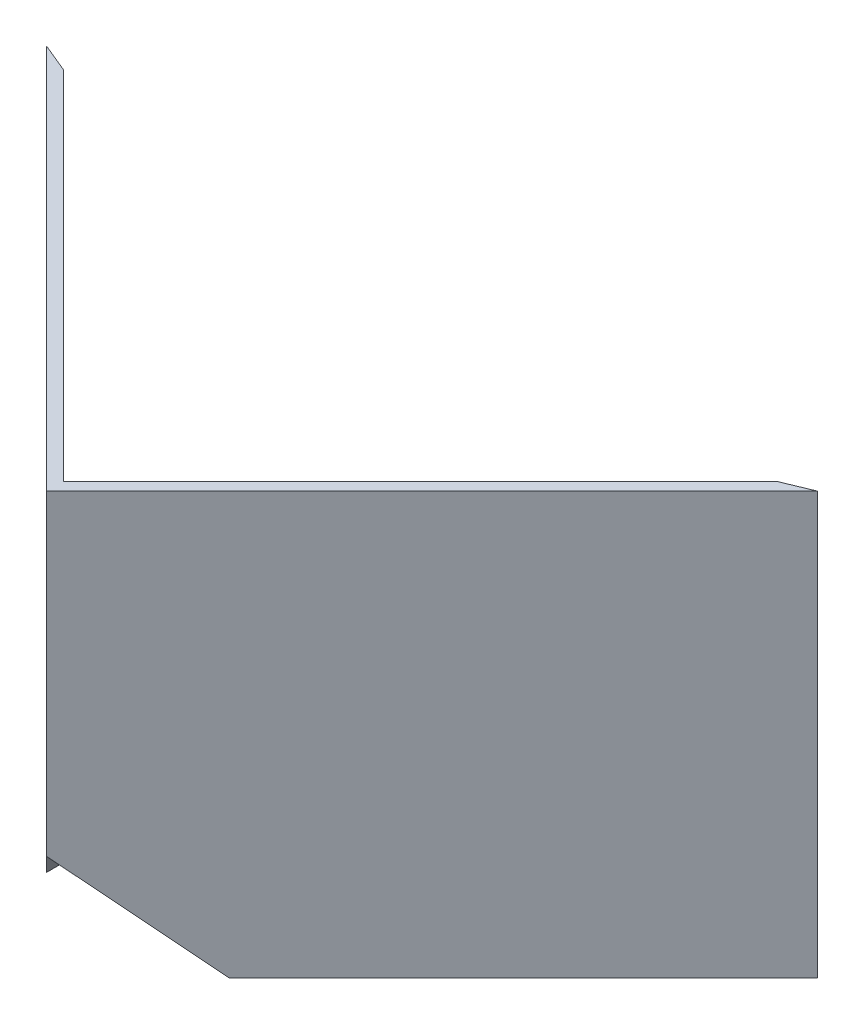
ISO-10303-21;
HEADER;
FILE_DESCRIPTION(('STEP AP214'),'2;1');
FILE_NAME('part.step','',(''),(''),'','','');
FILE_SCHEMA(('AUTOMOTIVE_DESIGN { 1 0 10303 214 1 1 1 1 }'));
ENDSEC;
DATA;
#1=APPLICATION_CONTEXT('core data for automotive mechanical design processes');
#2=APPLICATION_PROTOCOL_DEFINITION('international standard','automotive_design',2000,#1);
#3=PRODUCT_CONTEXT('',#1,'mechanical');
#4=PRODUCT('Part','Part','',(#3));
#5=PRODUCT_RELATED_PRODUCT_CATEGORY('part','',(#4));
#6=PRODUCT_DEFINITION_FORMATION('','',#4);
#7=PRODUCT_DEFINITION_CONTEXT('part definition',#1,'design');
#8=PRODUCT_DEFINITION('design','',#6,#7);
#9=PRODUCT_DEFINITION_SHAPE('','',#8);
#10=(LENGTH_UNIT() NAMED_UNIT(*) SI_UNIT(.MILLI.,.METRE.));
#11=(NAMED_UNIT(*) PLANE_ANGLE_UNIT() SI_UNIT($,.RADIAN.));
#12=(NAMED_UNIT(*) SI_UNIT($,.STERADIAN.) SOLID_ANGLE_UNIT());
#13=UNCERTAINTY_MEASURE_WITH_UNIT(LENGTH_MEASURE(1.E-05),#10,'distance_accuracy_value','');
#14=(GEOMETRIC_REPRESENTATION_CONTEXT(3) GLOBAL_UNCERTAINTY_ASSIGNED_CONTEXT((#13)) GLOBAL_UNIT_ASSIGNED_CONTEXT((#10,
#11,#12)) REPRESENTATION_CONTEXT('',''));
#15=CARTESIAN_POINT('',(0.,0.,0.));
#16=DIRECTION('',(0.,0.,1.));
#17=DIRECTION('',(1.,0.,0.));
#18=AXIS2_PLACEMENT_3D('',#15,#16,#17);
#19=CARTESIAN_POINT('',(0.,-35.,0.));
#20=DIRECTION('',(0.,-1.,0.));
#21=DIRECTION('',(0.,0.,-1.));
#22=AXIS2_PLACEMENT_3D('',#19,#20,#21);
#23=PLANE('',#22);
#24=DIRECTION('',(0.,0.,-1.));
#25=VECTOR('',#24,1.);
#26=CARTESIAN_POINT('',(-15.1800011305056,-35.,0.));
#27=LINE('',#26,#25);
#28=CARTESIAN_POINT('',(-15.1800011305056,-35.,48.8199997568609));
#29=VERTEX_POINT('',#28);
#30=CARTESIAN_POINT('',(-15.1800011305056,-35.,45.9915726064096));
#31=VERTEX_POINT('',#30);
#32=EDGE_CURVE('E11',#29,#31,#27,.T.);
#33=ORIENTED_EDGE('',*,*,#32,.F.);
#34=DIRECTION('',(0.707106774760258,0.,0.707106787612837));
#35=VECTOR('',#34,1.);
#36=CARTESIAN_POINT('',(-1.13050556416194E-06,-35.,64.0000000327771));
#37=LINE('',#36,#35);
#38=CARTESIAN_POINT('',(-64.,-35.,0.));
#39=VERTEX_POINT('',#38);
#40=EDGE_CURVE('E135',#39,#29,#37,.T.);
#41=ORIENTED_EDGE('',*,*,#40,.F.);
#42=DIRECTION('',(-0.923879530772346,0.,-0.382683436563264));
#43=VECTOR('',#42,1.);
#44=CARTESIAN_POINT('',(-59.1715729373115,-35.,2.));
#45=LINE('',#44,#43);
#46=CARTESIAN_POINT('',(-59.1715729373115,-35.,2.));
#47=VERTEX_POINT('',#46);
#48=EDGE_CURVE('E133',#47,#39,#45,.T.);
#49=ORIENTED_EDGE('',*,*,#48,.F.);
#50=DIRECTION('',(-0.707106774760258,0.,-0.707106787612837));
#51=VECTOR('',#50,1.);
#52=CARTESIAN_POINT('',(-1.10480040903317E-06,-35.,61.1715729080309));
#53=LINE('',#52,#51);
#54=EDGE_CURVE('E130',#31,#47,#53,.T.);
#55=ORIENTED_EDGE('',*,*,#54,.F.);
#56=EDGE_LOOP('',(#33,#41,#49,#55));
#57=FACE_BOUND('',#56,.T.);
#58=ADVANCED_FACE('F33',(#57),#23,.T.);
#59=CARTESIAN_POINT('',(59.1715728787502,35.,2.));
#60=DIRECTION('',(0.707106774760258,0.,0.707106787612837));
#61=DIRECTION('',(0.707106787612837,0.,-0.707106774760258));
#62=AXIS2_PLACEMENT_3D('',#59,#60,#61);
#63=PLANE('',#62);
#64=DIRECTION('',(-0.707106787612837,0.,0.707106774760258));
#65=VECTOR('',#64,1.);
#66=CARTESIAN_POINT('',(59.1715728787502,-35.,2.));
#67=LINE('',#66,#65);
#68=CARTESIAN_POINT('',(59.1715728787502,-35.,2.));
#69=VERTEX_POINT('',#68);
#70=CARTESIAN_POINT('',(15.1799988694944,-35.,45.9915732096521));
#71=VERTEX_POINT('',#70);
#72=EDGE_CURVE('E127',#69,#71,#67,.T.);
#73=ORIENTED_EDGE('',*,*,#72,.T.);
#74=DIRECTION('',(-0.548077019880069,0.631841096699684,0.548077009918061));
#75=VECTOR('',#74,1.);
#76=CARTESIAN_POINT('',(17.3682862122527,-37.5227291500837,43.8032859066688));
#77=LINE('',#76,#75);
#78=CARTESIAN_POINT('',(-1.13050556936611E-06,-17.5,61.1715728823257));
#79=VERTEX_POINT('',#78);
#80=EDGE_CURVE('E48',#71,#79,#77,.T.);
#81=ORIENTED_EDGE('',*,*,#80,.T.);
#82=DIRECTION('',(0.,-1.,0.));
#83=VECTOR('',#82,1.);
#84=CARTESIAN_POINT('',(-1.10480040903317E-06,35.,61.1715729080309));
#85=LINE('',#84,#83);
#86=CARTESIAN_POINT('',(-1.10480040903317E-06,35.,61.1715729080309));
#87=VERTEX_POINT('',#86);
#88=EDGE_CURVE('E147',#87,#79,#85,.T.);
#89=ORIENTED_EDGE('',*,*,#88,.F.);
#90=DIRECTION('',(-0.707106787612837,0.,0.707106774760258));
#91=VECTOR('',#90,1.);
#92=CARTESIAN_POINT('',(59.1715728787502,35.,2.));
#93=LINE('',#92,#91);
#94=CARTESIAN_POINT('',(59.1715728787502,35.,2.));
#95=VERTEX_POINT('',#94);
#96=EDGE_CURVE('E140',#95,#87,#93,.T.);
#97=ORIENTED_EDGE('',*,*,#96,.F.);
#98=DIRECTION('',(0.,-1.,0.));
#99=VECTOR('',#98,1.);
#100=CARTESIAN_POINT('',(59.1715728787502,35.,2.));
#101=LINE('',#100,#99);
#102=EDGE_CURVE('E123',#95,#69,#101,.T.);
#103=ORIENTED_EDGE('',*,*,#102,.T.);
#104=EDGE_LOOP('',(#73,#81,#89,#97,#103));
#105=FACE_BOUND('',#104,.T.);
#106=ADVANCED_FACE('F35',(#105),#63,.F.);
#107=CARTESIAN_POINT('',(-1.10480040903317E-06,35.,61.1715729080309));
#108=DIRECTION('',(-0.707106787612837,0.,0.707106774760258));
#109=DIRECTION('',(0.707106774760258,0.,0.707106787612837));
#110=AXIS2_PLACEMENT_3D('',#107,#108,#109);
#111=PLANE('',#110);
#112=ORIENTED_EDGE('',*,*,#88,.T.);
#113=DIRECTION('',(-0.548077013895126,-0.631841089800046,-0.548077023857133));
#114=VECTOR('',#113,1.);
#115=CARTESIAN_POINT('',(18.1806217170147,3.45921606268804,79.3521960603023));
#116=LINE('',#115,#114);
#117=EDGE_CURVE('E131',#79,#31,#116,.T.);
#118=ORIENTED_EDGE('',*,*,#117,.T.);
#119=ORIENTED_EDGE('',*,*,#54,.T.);
#120=DIRECTION('',(0.,-1.,0.));
#121=VECTOR('',#120,1.);
#122=CARTESIAN_POINT('',(-59.1715729373115,35.,2.));
#123=LINE('',#122,#121);
#124=CARTESIAN_POINT('',(-59.1715729373115,35.,2.));
#125=VERTEX_POINT('',#124);
#126=EDGE_CURVE('E144',#125,#47,#123,.T.);
#127=ORIENTED_EDGE('',*,*,#126,.F.);
#128=DIRECTION('',(-0.707106774760258,0.,-0.707106787612837));
#129=VECTOR('',#128,1.);
#130=CARTESIAN_POINT('',(-1.10480040903317E-06,35.,61.1715729080309));
#131=LINE('',#130,#129);
#132=EDGE_CURVE('E87',#87,#125,#131,.T.);
#133=ORIENTED_EDGE('',*,*,#132,.F.);
#134=EDGE_LOOP('',(#112,#118,#119,#127,#133));
#135=FACE_BOUND('',#134,.T.);
#136=ADVANCED_FACE('F180',(#135),#111,.F.);
#137=CARTESIAN_POINT('',(-59.1715729373115,35.,2.));
#138=DIRECTION('',(-0.382683436563264,0.,0.923879530772346));
#139=DIRECTION('',(0.923879530772346,0.,0.382683436563264));
#140=AXIS2_PLACEMENT_3D('',#137,#138,#139);
#141=PLANE('',#140);
#142=ORIENTED_EDGE('',*,*,#48,.T.);
#143=DIRECTION('',(0.,-1.,0.));
#144=VECTOR('',#143,1.);
#145=CARTESIAN_POINT('',(-64.,35.,0.));
#146=LINE('',#145,#144);
#147=CARTESIAN_POINT('',(-64.,35.,0.));
#148=VERTEX_POINT('',#147);
#149=EDGE_CURVE('E118',#148,#39,#146,.T.);
#150=ORIENTED_EDGE('',*,*,#149,.F.);
#151=DIRECTION('',(-0.923879530772346,0.,-0.382683436563264));
#152=VECTOR('',#151,1.);
#153=CARTESIAN_POINT('',(-59.1715729373115,35.,2.));
#154=LINE('',#153,#152);
#155=EDGE_CURVE('E103',#125,#148,#154,.T.);
#156=ORIENTED_EDGE('',*,*,#155,.F.);
#157=ORIENTED_EDGE('',*,*,#126,.T.);
#158=EDGE_LOOP('',(#142,#150,#156,#157));
#159=FACE_BOUND('',#158,.T.);
#160=ADVANCED_FACE('F205',(#159),#141,.F.);
#161=CARTESIAN_POINT('',(-1.13050556416194E-06,35.,64.0000000327771));
#162=DIRECTION('',(0.707106787612837,0.,-0.707106774760258));
#163=DIRECTION('',(-0.707106774760258,0.,-0.707106787612837));
#164=AXIS2_PLACEMENT_3D('',#161,#162,#163);
#165=PLANE('',#164);
#166=ORIENTED_EDGE('',*,*,#40,.T.);
#167=DIRECTION('',(0.548077013895126,0.631841089800046,0.548077023857133));
#168=VECTOR('',#167,1.);
#169=CARTESIAN_POINT('',(18.1806217015716,3.45921604488478,82.1806231953106));
#170=LINE('',#169,#168);
#171=CARTESIAN_POINT('',(-1.13050556416194E-06,-17.5,64.0000000327771));
#172=VERTEX_POINT('',#171);
#173=EDGE_CURVE('E115',#29,#172,#170,.T.);
#174=ORIENTED_EDGE('',*,*,#173,.T.);
#175=DIRECTION('',(0.,-1.,0.));
#176=VECTOR('',#175,1.);
#177=CARTESIAN_POINT('',(-1.13050556416194E-06,35.,64.0000000327771));
#178=LINE('',#177,#176);
#179=CARTESIAN_POINT('',(-1.13050556416194E-06,35.,64.0000000327771));
#180=VERTEX_POINT('',#179);
#181=EDGE_CURVE('E110',#180,#172,#178,.T.);
#182=ORIENTED_EDGE('',*,*,#181,.F.);
#183=DIRECTION('',(0.707106774760258,0.,0.707106787612837));
#184=VECTOR('',#183,1.);
#185=CARTESIAN_POINT('',(-1.13050556416194E-06,35.,64.0000000327771));
#186=LINE('',#185,#184);
#187=EDGE_CURVE('E96',#148,#180,#186,.T.);
#188=ORIENTED_EDGE('',*,*,#187,.F.);
#189=ORIENTED_EDGE('',*,*,#149,.T.);
#190=EDGE_LOOP('',(#166,#174,#182,#188,#189));
#191=FACE_BOUND('',#190,.T.);
#192=ADVANCED_FACE('F112',(#191),#165,.F.);
#193=CARTESIAN_POINT('',(64.0000000655541,35.,0.));
#194=DIRECTION('',(-0.707106774760258,0.,-0.707106787612837));
#195=DIRECTION('',(-0.707106787612837,0.,0.707106774760258));
#196=AXIS2_PLACEMENT_3D('',#193,#194,#195);
#197=PLANE('',#196);
#198=ORIENTED_EDGE('',*,*,#181,.T.);
#199=DIRECTION('',(0.548077019880069,-0.631841096699684,-0.548077009918062));
#200=VECTOR('',#199,1.);
#201=CARTESIAN_POINT('',(20.269093384287,-40.866874440637,43.7309058864015));
#202=LINE('',#201,#200);
#203=CARTESIAN_POINT('',(15.1799988694944,-35.,48.8200003086932));
#204=VERTEX_POINT('',#203);
#205=EDGE_CURVE('E151',#172,#204,#202,.T.);
#206=ORIENTED_EDGE('',*,*,#205,.T.);
#207=DIRECTION('',(0.707106787612837,0.,-0.707106774760258));
#208=VECTOR('',#207,1.);
#209=CARTESIAN_POINT('',(64.0000000655541,-35.,0.));
#210=LINE('',#209,#208);
#211=CARTESIAN_POINT('',(64.0000000655541,-35.,0.));
#212=VERTEX_POINT('',#211);
#213=EDGE_CURVE('E137',#204,#212,#210,.T.);
#214=ORIENTED_EDGE('',*,*,#213,.T.);
#215=DIRECTION('',(0.,-1.,0.));
#216=VECTOR('',#215,1.);
#217=CARTESIAN_POINT('',(64.0000000655541,35.,0.));
#218=LINE('',#217,#216);
#219=CARTESIAN_POINT('',(64.0000000655541,35.,0.));
#220=VERTEX_POINT('',#219);
#221=EDGE_CURVE('E119',#220,#212,#218,.T.);
#222=ORIENTED_EDGE('',*,*,#221,.F.);
#223=DIRECTION('',(0.707106787612837,0.,-0.707106774760258));
#224=VECTOR('',#223,1.);
#225=CARTESIAN_POINT('',(64.0000000655541,35.,0.));
#226=LINE('',#225,#224);
#227=EDGE_CURVE('E100',#180,#220,#226,.T.);
#228=ORIENTED_EDGE('',*,*,#227,.F.);
#229=EDGE_LOOP('',(#198,#206,#214,#222,#228));
#230=FACE_BOUND('',#229,.T.);
#231=ADVANCED_FACE('F121',(#230),#197,.F.);
#232=CARTESIAN_POINT('',(64.0000000655541,35.,0.));
#233=DIRECTION('',(0.382683428166914,0.,0.923879534250228));
#234=DIRECTION('',(0.923879534250228,0.,-0.382683428166914));
#235=AXIS2_PLACEMENT_3D('',#232,#233,#234);
#236=PLANE('',#235);
#237=DIRECTION('',(-0.923879534250228,0.,0.382683428166914));
#238=VECTOR('',#237,1.);
#239=CARTESIAN_POINT('',(64.0000000655541,-35.,0.));
#240=LINE('',#239,#238);
#241=EDGE_CURVE('E78',#212,#69,#240,.T.);
#242=ORIENTED_EDGE('',*,*,#241,.T.);
#243=ORIENTED_EDGE('',*,*,#102,.F.);
#244=DIRECTION('',(-0.923879534250228,0.,0.382683428166914));
#245=VECTOR('',#244,1.);
#246=CARTESIAN_POINT('',(64.0000000655541,35.,0.));
#247=LINE('',#246,#245);
#248=EDGE_CURVE('E57',#220,#95,#247,.T.);
#249=ORIENTED_EDGE('',*,*,#248,.F.);
#250=ORIENTED_EDGE('',*,*,#221,.T.);
#251=EDGE_LOOP('',(#242,#243,#249,#250));
#252=FACE_BOUND('',#251,.T.);
#253=ADVANCED_FACE('F165',(#252),#236,.F.);
#254=CARTESIAN_POINT('',(0.,35.,0.));
#255=DIRECTION('',(0.,-1.,0.));
#256=DIRECTION('',(0.,0.,-1.));
#257=AXIS2_PLACEMENT_3D('',#254,#255,#256);
#258=PLANE('',#257);
#259=ORIENTED_EDGE('',*,*,#96,.T.);
#260=ORIENTED_EDGE('',*,*,#132,.T.);
#261=ORIENTED_EDGE('',*,*,#155,.T.);
#262=ORIENTED_EDGE('',*,*,#187,.T.);
#263=ORIENTED_EDGE('',*,*,#227,.T.);
#264=ORIENTED_EDGE('',*,*,#248,.T.);
#265=EDGE_LOOP('',(#259,#260,#261,#262,#263,#264));
#266=FACE_BOUND('',#265,.T.);
#267=ADVANCED_FACE('F98',(#266),#258,.F.);
#268=DIRECTION('',(0.,0.,1.));
#269=VECTOR('',#268,1.);
#270=CARTESIAN_POINT('',(15.1799988694944,-35.,0.));
#271=LINE('',#270,#269);
#272=EDGE_CURVE('E41',#71,#204,#271,.T.);
#273=ORIENTED_EDGE('',*,*,#272,.F.);
#274=ORIENTED_EDGE('',*,*,#72,.F.);
#275=ORIENTED_EDGE('',*,*,#241,.F.);
#276=ORIENTED_EDGE('',*,*,#213,.F.);
#277=EDGE_LOOP('',(#273,#274,#275,#276));
#278=FACE_BOUND('',#277,.T.);
#279=ADVANCED_FACE('F161',(#278),#23,.T.);
#280=CARTESIAN_POINT('',(-15.1800011305056,-35.,0.));
#281=DIRECTION('',(-0.755404159854081,0.655259151233426,0.));
#282=DIRECTION('',(-0.655259151233426,-0.755404159854081,0.));
#283=AXIS2_PLACEMENT_3D('',#280,#281,#282);
#284=PLANE('',#283);
#285=DIRECTION('',(0.,0.,1.));
#286=VECTOR('',#285,1.);
#287=CARTESIAN_POINT('',(-1.13050556416194E-06,-17.5,0.));
#288=LINE('',#287,#286);
#289=EDGE_CURVE('E159',#79,#172,#288,.T.);
#290=ORIENTED_EDGE('',*,*,#289,.T.);
#291=ORIENTED_EDGE('',*,*,#173,.F.);
#292=ORIENTED_EDGE('',*,*,#32,.T.);
#293=ORIENTED_EDGE('',*,*,#117,.F.);
#294=EDGE_LOOP('',(#290,#291,#292,#293));
#295=FACE_BOUND('',#294,.T.);
#296=ADVANCED_FACE('F183',(#295),#284,.F.);
#297=CARTESIAN_POINT('',(-1.13050556416194E-06,-17.5,0.));
#298=DIRECTION('',(0.755404159854081,0.655259151233426,0.));
#299=DIRECTION('',(-0.655259151233426,0.755404159854081,0.));
#300=AXIS2_PLACEMENT_3D('',#297,#298,#299);
#301=PLANE('',#300);
#302=ORIENTED_EDGE('',*,*,#272,.T.);
#303=ORIENTED_EDGE('',*,*,#205,.F.);
#304=ORIENTED_EDGE('',*,*,#289,.F.);
#305=ORIENTED_EDGE('',*,*,#80,.F.);
#306=EDGE_LOOP('',(#302,#303,#304,#305));
#307=FACE_BOUND('',#306,.T.);
#308=ADVANCED_FACE('F150',(#307),#301,.F.);
#309=CLOSED_SHELL('',(#58,#106,#136,#160,#192,#231,#253,#267,#279,#296,#308));
#310=MANIFOLD_SOLID_BREP('B2',#309);
#311=ADVANCED_BREP_SHAPE_REPRESENTATION('',(#18,#310),#14);
#312=SHAPE_DEFINITION_REPRESENTATION(#9,#311);
ENDSEC;
END-ISO-10303-21;
